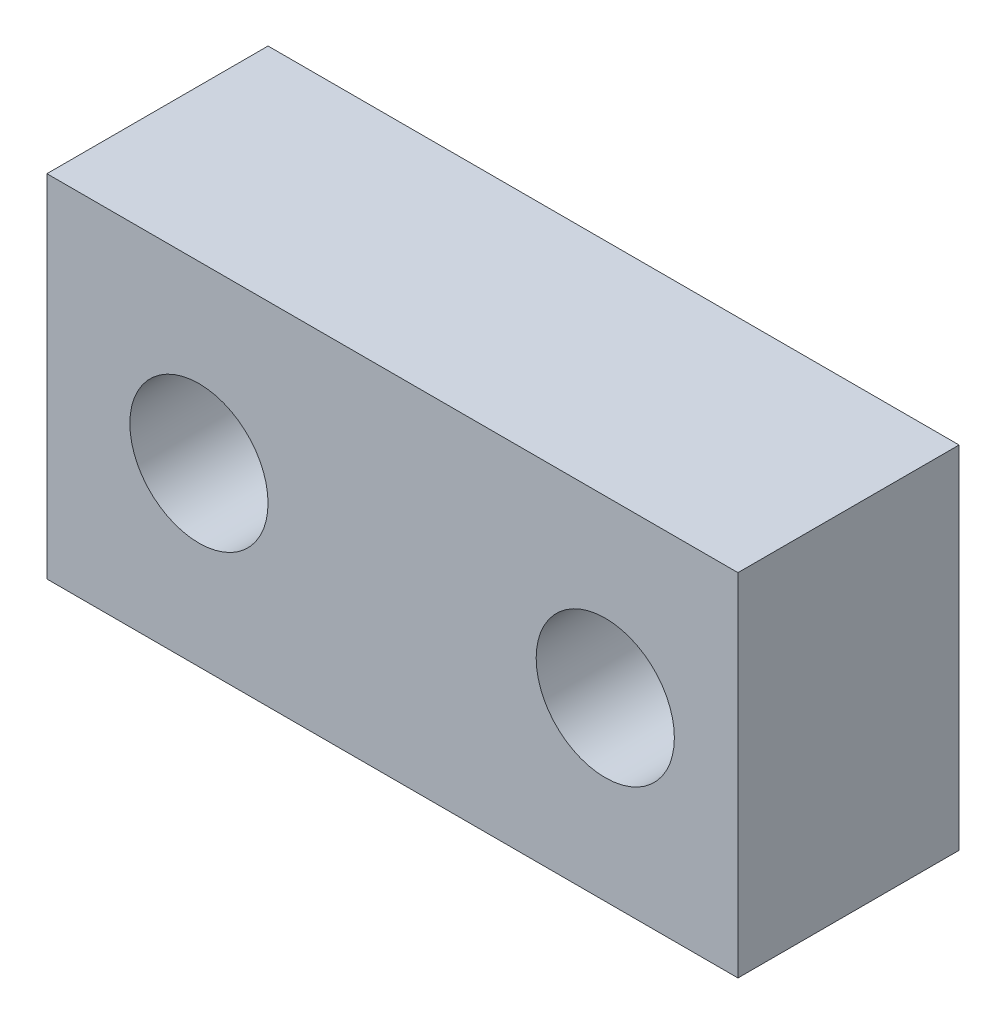
ISO-10303-21;
HEADER;
FILE_DESCRIPTION(('STEP AP214'),'2;1');
FILE_NAME('part.step','',(''),(''),'','','');
FILE_SCHEMA(('AUTOMOTIVE_DESIGN { 1 0 10303 214 1 1 1 1 }'));
ENDSEC;
DATA;
#1=APPLICATION_CONTEXT('core data for automotive mechanical design processes');
#2=APPLICATION_PROTOCOL_DEFINITION('international standard','automotive_design',2000,#1);
#3=PRODUCT_CONTEXT('',#1,'mechanical');
#4=PRODUCT('Part','Part','',(#3));
#5=PRODUCT_RELATED_PRODUCT_CATEGORY('part','',(#4));
#6=PRODUCT_DEFINITION_FORMATION('','',#4);
#7=PRODUCT_DEFINITION_CONTEXT('part definition',#1,'design');
#8=PRODUCT_DEFINITION('design','',#6,#7);
#9=PRODUCT_DEFINITION_SHAPE('','',#8);
#10=(LENGTH_UNIT() NAMED_UNIT(*) SI_UNIT(.MILLI.,.METRE.));
#11=(NAMED_UNIT(*) PLANE_ANGLE_UNIT() SI_UNIT($,.RADIAN.));
#12=(NAMED_UNIT(*) SI_UNIT($,.STERADIAN.) SOLID_ANGLE_UNIT());
#13=UNCERTAINTY_MEASURE_WITH_UNIT(LENGTH_MEASURE(1.E-05),#10,'distance_accuracy_value','');
#14=(GEOMETRIC_REPRESENTATION_CONTEXT(3) GLOBAL_UNCERTAINTY_ASSIGNED_CONTEXT((#13)) GLOBAL_UNIT_ASSIGNED_CONTEXT((#10,
#11,#12)) REPRESENTATION_CONTEXT('',''));
#15=CARTESIAN_POINT('',(0.,0.,0.));
#16=DIRECTION('',(0.,0.,1.));
#17=DIRECTION('',(1.,0.,0.));
#18=AXIS2_PLACEMENT_3D('',#15,#16,#17);
#19=CARTESIAN_POINT('',(12.5,6.35,8.));
#20=DIRECTION('',(-1.,0.,0.));
#21=DIRECTION('',(0.,0.,1.));
#22=AXIS2_PLACEMENT_3D('',#19,#20,#21);
#23=PLANE('',#22);
#24=DIRECTION('',(0.,1.,0.));
#25=VECTOR('',#24,1.);
#26=CARTESIAN_POINT('',(12.5,6.35,0.));
#27=LINE('',#26,#25);
#28=CARTESIAN_POINT('',(12.5,-6.35,0.));
#29=VERTEX_POINT('',#28);
#30=CARTESIAN_POINT('',(12.5,6.35,0.));
#31=VERTEX_POINT('',#30);
#32=EDGE_CURVE('E113',#29,#31,#27,.T.);
#33=ORIENTED_EDGE('',*,*,#32,.T.);
#34=DIRECTION('',(0.,0.,-1.));
#35=VECTOR('',#34,1.);
#36=CARTESIAN_POINT('',(12.5,6.35,8.));
#37=LINE('',#36,#35);
#38=CARTESIAN_POINT('',(12.5,6.35,8.));
#39=VERTEX_POINT('',#38);
#40=EDGE_CURVE('E11',#39,#31,#37,.T.);
#41=ORIENTED_EDGE('',*,*,#40,.F.);
#42=DIRECTION('',(0.,1.,0.));
#43=VECTOR('',#42,1.);
#44=CARTESIAN_POINT('',(12.5,6.35,8.));
#45=LINE('',#44,#43);
#46=CARTESIAN_POINT('',(12.5,-6.35,8.));
#47=VERTEX_POINT('',#46);
#48=EDGE_CURVE('E97',#47,#39,#45,.T.);
#49=ORIENTED_EDGE('',*,*,#48,.F.);
#50=DIRECTION('',(0.,0.,-1.));
#51=VECTOR('',#50,1.);
#52=CARTESIAN_POINT('',(12.5,-6.35,8.));
#53=LINE('',#52,#51);
#54=EDGE_CURVE('E109',#47,#29,#53,.T.);
#55=ORIENTED_EDGE('',*,*,#54,.T.);
#56=EDGE_LOOP('',(#33,#41,#49,#55));
#57=FACE_BOUND('',#56,.T.);
#58=ADVANCED_FACE('F45',(#57),#23,.F.);
#59=CARTESIAN_POINT('',(-12.5,6.35,8.));
#60=DIRECTION('',(0.,-1.,0.));
#61=DIRECTION('',(0.,0.,-1.));
#62=AXIS2_PLACEMENT_3D('',#59,#60,#61);
#63=PLANE('',#62);
#64=DIRECTION('',(-1.,0.,0.));
#65=VECTOR('',#64,1.);
#66=CARTESIAN_POINT('',(-12.5,6.35,0.));
#67=LINE('',#66,#65);
#68=CARTESIAN_POINT('',(-12.5,6.35,0.));
#69=VERTEX_POINT('',#68);
#70=EDGE_CURVE('E102',#31,#69,#67,.T.);
#71=ORIENTED_EDGE('',*,*,#70,.T.);
#72=DIRECTION('',(0.,0.,-1.));
#73=VECTOR('',#72,1.);
#74=CARTESIAN_POINT('',(-12.5,6.35,8.));
#75=LINE('',#74,#73);
#76=CARTESIAN_POINT('',(-12.5,6.35,8.));
#77=VERTEX_POINT('',#76);
#78=EDGE_CURVE('E54',#77,#69,#75,.T.);
#79=ORIENTED_EDGE('',*,*,#78,.F.);
#80=DIRECTION('',(-1.,0.,0.));
#81=VECTOR('',#80,1.);
#82=CARTESIAN_POINT('',(-12.5,6.35,8.));
#83=LINE('',#82,#81);
#84=EDGE_CURVE('E92',#39,#77,#83,.T.);
#85=ORIENTED_EDGE('',*,*,#84,.F.);
#86=ORIENTED_EDGE('',*,*,#40,.T.);
#87=EDGE_LOOP('',(#71,#79,#85,#86));
#88=FACE_BOUND('',#87,.T.);
#89=ADVANCED_FACE('F101',(#88),#63,.F.);
#90=CARTESIAN_POINT('',(-12.5,6.35,8.));
#91=DIRECTION('',(1.,0.,0.));
#92=DIRECTION('',(0.,0.,-1.));
#93=AXIS2_PLACEMENT_3D('',#90,#91,#92);
#94=PLANE('',#93);
#95=DIRECTION('',(0.,-1.,0.));
#96=VECTOR('',#95,1.);
#97=CARTESIAN_POINT('',(-12.5,6.35,0.));
#98=LINE('',#97,#96);
#99=CARTESIAN_POINT('',(-12.5,-6.35,0.));
#100=VERTEX_POINT('',#99);
#101=EDGE_CURVE('E79',#69,#100,#98,.T.);
#102=ORIENTED_EDGE('',*,*,#101,.T.);
#103=DIRECTION('',(0.,0.,-1.));
#104=VECTOR('',#103,1.);
#105=CARTESIAN_POINT('',(-12.5,-6.35,8.));
#106=LINE('',#105,#104);
#107=CARTESIAN_POINT('',(-12.5,-6.35,8.));
#108=VERTEX_POINT('',#107);
#109=EDGE_CURVE('E104',#108,#100,#106,.T.);
#110=ORIENTED_EDGE('',*,*,#109,.F.);
#111=DIRECTION('',(0.,-1.,0.));
#112=VECTOR('',#111,1.);
#113=CARTESIAN_POINT('',(-12.5,6.35,8.));
#114=LINE('',#113,#112);
#115=EDGE_CURVE('E95',#77,#108,#114,.T.);
#116=ORIENTED_EDGE('',*,*,#115,.F.);
#117=ORIENTED_EDGE('',*,*,#78,.T.);
#118=EDGE_LOOP('',(#102,#110,#116,#117));
#119=FACE_BOUND('',#118,.T.);
#120=ADVANCED_FACE('F105',(#119),#94,.F.);
#121=CARTESIAN_POINT('',(-12.5,-6.35,8.));
#122=DIRECTION('',(0.,1.,0.));
#123=DIRECTION('',(0.,0.,1.));
#124=AXIS2_PLACEMENT_3D('',#121,#122,#123);
#125=PLANE('',#124);
#126=DIRECTION('',(1.,0.,0.));
#127=VECTOR('',#126,1.);
#128=CARTESIAN_POINT('',(-12.5,-6.35,0.));
#129=LINE('',#128,#127);
#130=EDGE_CURVE('E85',#100,#29,#129,.T.);
#131=ORIENTED_EDGE('',*,*,#130,.T.);
#132=ORIENTED_EDGE('',*,*,#54,.F.);
#133=DIRECTION('',(1.,0.,0.));
#134=VECTOR('',#133,1.);
#135=CARTESIAN_POINT('',(-12.5,-6.35,8.));
#136=LINE('',#135,#134);
#137=EDGE_CURVE('E62',#108,#47,#136,.T.);
#138=ORIENTED_EDGE('',*,*,#137,.F.);
#139=ORIENTED_EDGE('',*,*,#109,.T.);
#140=EDGE_LOOP('',(#131,#132,#138,#139));
#141=FACE_BOUND('',#140,.T.);
#142=ADVANCED_FACE('F127',(#141),#125,.F.);
#143=CARTESIAN_POINT('',(0.,0.,8.));
#144=DIRECTION('',(0.,0.,1.));
#145=DIRECTION('',(1.,0.,0.));
#146=AXIS2_PLACEMENT_3D('',#143,#144,#145);
#147=PLANE('',#146);
#148=CARTESIAN_POINT('',(7.69999999999999,0.0250000000001657,8.));
#149=DIRECTION('',(0.,0.,1.));
#150=DIRECTION('',(1.,0.,0.));
#151=AXIS2_PLACEMENT_3D('',#148,#149,#150);
#152=CIRCLE('',#151,2.49999999999999);
#153=CARTESIAN_POINT('',(10.2,0.0250000000001657,8.));
#154=VERTEX_POINT('',#153);
#155=EDGE_CURVE('E117',#154,#154,#152,.T.);
#156=ORIENTED_EDGE('',*,*,#155,.F.);
#157=EDGE_LOOP('',(#156));
#158=FACE_BOUND('',#157,.T.);
#159=CARTESIAN_POINT('',(-7.,0.0250000000001649,8.));
#160=DIRECTION('',(0.,0.,1.));
#161=DIRECTION('',(1.,0.,0.));
#162=AXIS2_PLACEMENT_3D('',#159,#160,#161);
#163=CIRCLE('',#162,2.5);
#164=CARTESIAN_POINT('',(-4.5,0.0250000000001649,8.));
#165=VERTEX_POINT('',#164);
#166=EDGE_CURVE('E137',#165,#165,#163,.T.);
#167=ORIENTED_EDGE('',*,*,#166,.F.);
#168=EDGE_LOOP('',(#167));
#169=FACE_BOUND('',#168,.T.);
#170=ORIENTED_EDGE('',*,*,#48,.T.);
#171=ORIENTED_EDGE('',*,*,#84,.T.);
#172=ORIENTED_EDGE('',*,*,#115,.T.);
#173=ORIENTED_EDGE('',*,*,#137,.T.);
#174=EDGE_LOOP('',(#170,#171,#172,#173));
#175=FACE_BOUND('',#174,.T.);
#176=ADVANCED_FACE('F93',(#158,#169,#175),#147,.T.);
#177=CARTESIAN_POINT('',(0.,0.,0.));
#178=DIRECTION('',(0.,0.,1.));
#179=DIRECTION('',(1.,0.,0.));
#180=AXIS2_PLACEMENT_3D('',#177,#178,#179);
#181=PLANE('',#180);
#182=CARTESIAN_POINT('',(7.69999999999999,0.0250000000001657,0.));
#183=DIRECTION('',(0.,0.,-1.));
#184=DIRECTION('',(-1.,0.,0.));
#185=AXIS2_PLACEMENT_3D('',#182,#183,#184);
#186=CIRCLE('',#185,2.49999999999999);
#187=CARTESIAN_POINT('',(5.2,0.0250000000001657,0.));
#188=VERTEX_POINT('',#187);
#189=EDGE_CURVE('E141',#188,#188,#186,.T.);
#190=ORIENTED_EDGE('',*,*,#189,.F.);
#191=EDGE_LOOP('',(#190));
#192=FACE_BOUND('',#191,.T.);
#193=CARTESIAN_POINT('',(-7.,0.0250000000001649,0.));
#194=DIRECTION('',(0.,0.,-1.));
#195=DIRECTION('',(-1.,0.,0.));
#196=AXIS2_PLACEMENT_3D('',#193,#194,#195);
#197=CIRCLE('',#196,2.5);
#198=CARTESIAN_POINT('',(-9.5,0.0250000000001649,0.));
#199=VERTEX_POINT('',#198);
#200=EDGE_CURVE('E142',#199,#199,#197,.T.);
#201=ORIENTED_EDGE('',*,*,#200,.F.);
#202=EDGE_LOOP('',(#201));
#203=FACE_BOUND('',#202,.T.);
#204=ORIENTED_EDGE('',*,*,#32,.F.);
#205=ORIENTED_EDGE('',*,*,#130,.F.);
#206=ORIENTED_EDGE('',*,*,#101,.F.);
#207=ORIENTED_EDGE('',*,*,#70,.F.);
#208=EDGE_LOOP('',(#204,#205,#206,#207));
#209=FACE_BOUND('',#208,.T.);
#210=ADVANCED_FACE('F130',(#192,#203,#209),#181,.F.);
#211=CARTESIAN_POINT('',(-7.,0.0250000000001649,10.));
#212=DIRECTION('',(0.,0.,-1.));
#213=DIRECTION('',(-1.,0.,0.));
#214=AXIS2_PLACEMENT_3D('',#211,#212,#213);
#215=CYLINDRICAL_SURFACE('',#214,2.5);
#216=ORIENTED_EDGE('',*,*,#166,.T.);
#217=EDGE_LOOP('',(#216));
#218=FACE_BOUND('',#217,.T.);
#219=ORIENTED_EDGE('',*,*,#200,.T.);
#220=EDGE_LOOP('',(#219));
#221=FACE_BOUND('',#220,.T.);
#222=ADVANCED_FACE('F154',(#218,#221),#215,.F.);
#223=CARTESIAN_POINT('',(7.69999999999999,0.0250000000001657,10.));
#224=DIRECTION('',(0.,0.,-1.));
#225=DIRECTION('',(-1.,0.,0.));
#226=AXIS2_PLACEMENT_3D('',#223,#224,#225);
#227=CYLINDRICAL_SURFACE('',#226,2.49999999999999);
#228=ORIENTED_EDGE('',*,*,#155,.T.);
#229=EDGE_LOOP('',(#228));
#230=FACE_BOUND('',#229,.T.);
#231=ORIENTED_EDGE('',*,*,#189,.T.);
#232=EDGE_LOOP('',(#231));
#233=FACE_BOUND('',#232,.T.);
#234=ADVANCED_FACE('F150',(#230,#233),#227,.F.);
#235=CLOSED_SHELL('',(#58,#89,#120,#142,#176,#210,#222,#234));
#236=MANIFOLD_SOLID_BREP('B2',#235);
#237=ADVANCED_BREP_SHAPE_REPRESENTATION('',(#18,#236),#14);
#238=SHAPE_DEFINITION_REPRESENTATION(#9,#237);
ENDSEC;
END-ISO-10303-21;
